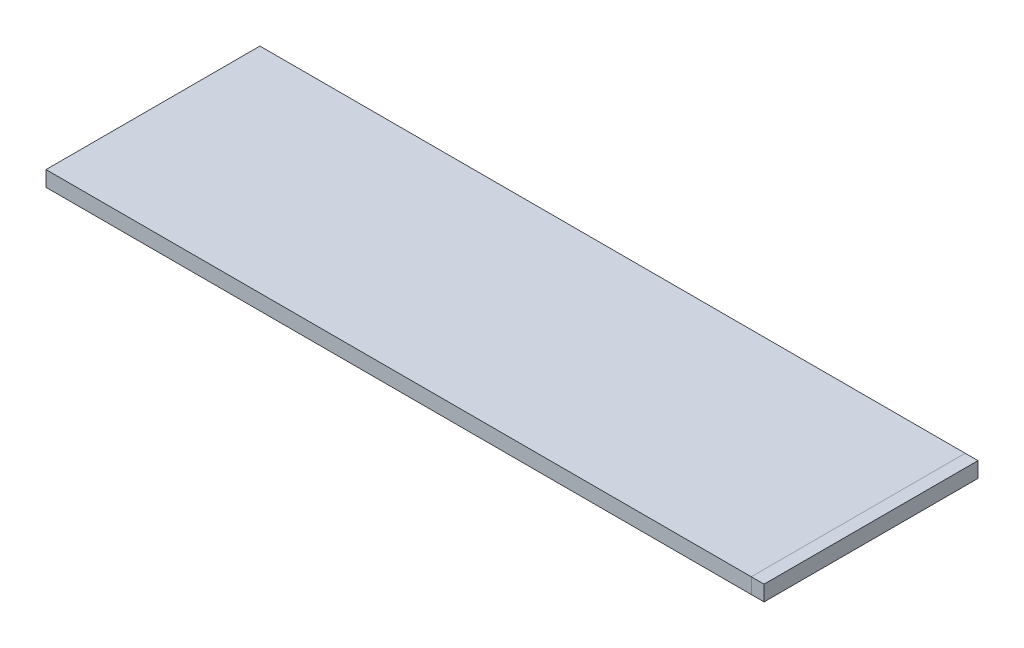
ISO-10303-21;
HEADER;
FILE_DESCRIPTION(('STEP AP214'),'2;1');
FILE_NAME('part.step','',(''),(''),'','','');
FILE_SCHEMA(('AUTOMOTIVE_DESIGN { 1 0 10303 214 1 1 1 1 }'));
ENDSEC;
DATA;
#1=APPLICATION_CONTEXT('core data for automotive mechanical design processes');
#2=APPLICATION_PROTOCOL_DEFINITION('international standard','automotive_design',2000,#1);
#3=PRODUCT_CONTEXT('',#1,'mechanical');
#4=PRODUCT('Part','Part','',(#3));
#5=PRODUCT_RELATED_PRODUCT_CATEGORY('part','',(#4));
#6=PRODUCT_DEFINITION_FORMATION('','',#4);
#7=PRODUCT_DEFINITION_CONTEXT('part definition',#1,'design');
#8=PRODUCT_DEFINITION('design','',#6,#7);
#9=PRODUCT_DEFINITION_SHAPE('','',#8);
#10=(LENGTH_UNIT() NAMED_UNIT(*) SI_UNIT(.MILLI.,.METRE.));
#11=(NAMED_UNIT(*) PLANE_ANGLE_UNIT() SI_UNIT($,.RADIAN.));
#12=(NAMED_UNIT(*) SI_UNIT($,.STERADIAN.) SOLID_ANGLE_UNIT());
#13=UNCERTAINTY_MEASURE_WITH_UNIT(LENGTH_MEASURE(1.E-05),#10,'distance_accuracy_value','');
#14=(GEOMETRIC_REPRESENTATION_CONTEXT(3) GLOBAL_UNCERTAINTY_ASSIGNED_CONTEXT((#13)) GLOBAL_UNIT_ASSIGNED_CONTEXT((#10,
#11,#12)) REPRESENTATION_CONTEXT('',''));
#15=CARTESIAN_POINT('',(0.,0.,0.));
#16=DIRECTION('',(0.,0.,1.));
#17=DIRECTION('',(1.,0.,0.));
#18=AXIS2_PLACEMENT_3D('',#15,#16,#17);
#19=CARTESIAN_POINT('',(-688.586595900051,2.34974736347021E-10,4.0880635946293E-11));
#20=DIRECTION('',(-1.,3.29102447715873E-13,0.));
#21=DIRECTION('',(0.,0.,-1.));
#22=AXIS2_PLACEMENT_3D('',#19,#20,#21);
#23=PLANE('',#22);
#24=DIRECTION('',(-3.29102447715873E-13,-1.,0.));
#25=VECTOR('',#24,1.);
#26=CARTESIAN_POINT('',(-688.58659589993,80.1510631712111,1642.56024697432));
#27=LINE('',#26,#25);
#28=CARTESIAN_POINT('',(-688.58659589993,80.1510631713515,1642.56024697432));
#29=VERTEX_POINT('',#28);
#30=CARTESIAN_POINT('',(-688.58659589994,49.4824319362965,1642.56024697432));
#31=VERTEX_POINT('',#30);
#32=EDGE_CURVE('E72',#29,#31,#27,.T.);
#33=ORIENTED_EDGE('',*,*,#32,.F.);
#34=DIRECTION('',(0.,0.,1.));
#35=VECTOR('',#34,1.);
#36=CARTESIAN_POINT('',(-688.58659589993,80.1510631713515,1642.5602469743));
#37=LINE('',#36,#35);
#38=CARTESIAN_POINT('',(-688.586595899955,80.1510631713515,1217.11024697432));
#39=VERTEX_POINT('',#38);
#40=EDGE_CURVE('E95',#39,#29,#37,.T.);
#41=ORIENTED_EDGE('',*,*,#40,.F.);
#42=DIRECTION('',(3.29102447715873E-13,1.,0.));
#43=VECTOR('',#42,1.);
#44=CARTESIAN_POINT('',(-688.586595899955,80.1510631712111,1217.11024697432));
#45=LINE('',#44,#43);
#46=CARTESIAN_POINT('',(-688.586595899952,49.4824319362965,1217.11024697432));
#47=VERTEX_POINT('',#46);
#48=EDGE_CURVE('E100',#47,#39,#45,.T.);
#49=ORIENTED_EDGE('',*,*,#48,.F.);
#50=DIRECTION('',(0.,0.,-1.));
#51=VECTOR('',#50,1.);
#52=CARTESIAN_POINT('',(-688.58659589994,49.4824319362965,1642.5602469743));
#53=LINE('',#52,#51);
#54=EDGE_CURVE('E115',#31,#47,#53,.T.);
#55=ORIENTED_EDGE('',*,*,#54,.F.);
#56=EDGE_LOOP('',(#33,#41,#49,#55));
#57=FACE_BOUND('',#56,.T.);
#58=ADVANCED_FACE('F63',(#57),#23,.T.);
#59=CARTESIAN_POINT('',(713.986595899993,0.,1.86316690102693E-13));
#60=DIRECTION('',(1.,0.,0.));
#61=DIRECTION('',(0.,0.,-1.));
#62=AXIS2_PLACEMENT_3D('',#59,#60,#61);
#63=PLANE('',#62);
#64=DIRECTION('',(0.,-1.,0.));
#65=VECTOR('',#64,1.);
#66=CARTESIAN_POINT('',(713.986595899993,80.1510631713515,1642.56024697432));
#67=LINE('',#66,#65);
#68=CARTESIAN_POINT('',(713.986595899993,80.1510631713515,1642.56024697432));
#69=VERTEX_POINT('',#68);
#70=CARTESIAN_POINT('',(713.986595899993,49.4824319362965,1642.56024697432));
#71=VERTEX_POINT('',#70);
#72=EDGE_CURVE('E126',#69,#71,#67,.T.);
#73=ORIENTED_EDGE('',*,*,#72,.T.);
#74=DIRECTION('',(0.,0.,-1.));
#75=VECTOR('',#74,1.);
#76=CARTESIAN_POINT('',(713.986595899993,49.4824319362965,1642.56024697432));
#77=LINE('',#76,#75);
#78=CARTESIAN_POINT('',(713.986595899993,49.4824319362965,1217.11024697432));
#79=VERTEX_POINT('',#78);
#80=EDGE_CURVE('E113',#71,#79,#77,.T.);
#81=ORIENTED_EDGE('',*,*,#80,.T.);
#82=DIRECTION('',(0.,1.,0.));
#83=VECTOR('',#82,1.);
#84=CARTESIAN_POINT('',(713.986595899993,80.1510631713515,1217.11024697432));
#85=LINE('',#84,#83);
#86=CARTESIAN_POINT('',(713.986595899993,80.1510631713515,1217.11024697432));
#87=VERTEX_POINT('',#86);
#88=EDGE_CURVE('E117',#79,#87,#85,.T.);
#89=ORIENTED_EDGE('',*,*,#88,.T.);
#90=DIRECTION('',(0.,0.,1.));
#91=VECTOR('',#90,1.);
#92=CARTESIAN_POINT('',(713.986595899993,80.1510631713515,1642.56024697432));
#93=LINE('',#92,#91);
#94=EDGE_CURVE('E123',#87,#69,#93,.T.);
#95=ORIENTED_EDGE('',*,*,#94,.T.);
#96=EDGE_LOOP('',(#73,#81,#89,#95));
#97=FACE_BOUND('',#96,.T.);
#98=ADVANCED_FACE('F125',(#97),#63,.T.);
#99=CARTESIAN_POINT('',(-1115.14054025146,49.4824319362965,1642.56024697432));
#100=DIRECTION('',(0.,-1.,0.));
#101=DIRECTION('',(0.,0.,-1.));
#102=AXIS2_PLACEMENT_3D('',#99,#100,#101);
#103=PLANE('',#102);
#104=DIRECTION('',(1.,0.,0.));
#105=VECTOR('',#104,1.);
#106=CARTESIAN_POINT('',(-1115.14054025146,49.4824319362965,1642.56024697432));
#107=LINE('',#106,#105);
#108=EDGE_CURVE('E12',#31,#71,#107,.T.);
#109=ORIENTED_EDGE('',*,*,#108,.F.);
#110=ORIENTED_EDGE('',*,*,#54,.T.);
#111=DIRECTION('',(1.,0.,0.));
#112=VECTOR('',#111,1.);
#113=CARTESIAN_POINT('',(-1115.14054025146,49.4824319362965,1217.11024697432));
#114=LINE('',#113,#112);
#115=EDGE_CURVE('E110',#47,#79,#114,.T.);
#116=ORIENTED_EDGE('',*,*,#115,.T.);
#117=ORIENTED_EDGE('',*,*,#80,.F.);
#118=EDGE_LOOP('',(#109,#110,#116,#117));
#119=FACE_BOUND('',#118,.T.);
#120=ADVANCED_FACE('F111',(#119),#103,.T.);
#121=CARTESIAN_POINT('',(-1115.14054025146,80.1510631713515,1217.11024697432));
#122=DIRECTION('',(0.,0.,-1.));
#123=DIRECTION('',(-1.,0.,0.));
#124=AXIS2_PLACEMENT_3D('',#121,#122,#123);
#125=PLANE('',#124);
#126=ORIENTED_EDGE('',*,*,#115,.F.);
#127=ORIENTED_EDGE('',*,*,#48,.T.);
#128=DIRECTION('',(1.,0.,0.));
#129=VECTOR('',#128,1.);
#130=CARTESIAN_POINT('',(-1115.14054025146,80.1510631713515,1217.11024697432));
#131=LINE('',#130,#129);
#132=EDGE_CURVE('E105',#39,#87,#131,.T.);
#133=ORIENTED_EDGE('',*,*,#132,.T.);
#134=ORIENTED_EDGE('',*,*,#88,.F.);
#135=EDGE_LOOP('',(#126,#127,#133,#134));
#136=FACE_BOUND('',#135,.T.);
#137=ADVANCED_FACE('F118',(#136),#125,.T.);
#138=CARTESIAN_POINT('',(-1115.14054025146,80.1510631713515,1642.56024697432));
#139=DIRECTION('',(0.,1.,0.));
#140=DIRECTION('',(0.,0.,1.));
#141=AXIS2_PLACEMENT_3D('',#138,#139,#140);
#142=PLANE('',#141);
#143=ORIENTED_EDGE('',*,*,#132,.F.);
#144=ORIENTED_EDGE('',*,*,#40,.T.);
#145=DIRECTION('',(1.,0.,0.));
#146=VECTOR('',#145,1.);
#147=CARTESIAN_POINT('',(-1115.14054025146,80.1510631713515,1642.56024697432));
#148=LINE('',#147,#146);
#149=EDGE_CURVE('E139',#29,#69,#148,.T.);
#150=ORIENTED_EDGE('',*,*,#149,.T.);
#151=ORIENTED_EDGE('',*,*,#94,.F.);
#152=EDGE_LOOP('',(#143,#144,#150,#151));
#153=FACE_BOUND('',#152,.T.);
#154=ADVANCED_FACE('F147',(#153),#142,.T.);
#155=CARTESIAN_POINT('',(-1115.14054025146,80.1510631713515,1642.56024697432));
#156=DIRECTION('',(0.,0.,1.));
#157=DIRECTION('',(1.,0.,0.));
#158=AXIS2_PLACEMENT_3D('',#155,#156,#157);
#159=PLANE('',#158);
#160=ORIENTED_EDGE('',*,*,#149,.F.);
#161=ORIENTED_EDGE('',*,*,#32,.T.);
#162=ORIENTED_EDGE('',*,*,#108,.T.);
#163=ORIENTED_EDGE('',*,*,#72,.F.);
#164=EDGE_LOOP('',(#160,#161,#162,#163));
#165=FACE_BOUND('',#164,.T.);
#166=ADVANCED_FACE('F149',(#165),#159,.T.);
#167=CLOSED_SHELL('',(#58,#98,#120,#137,#154,#166));
#168=MANIFOLD_SOLID_BREP('B2',#167);
#169=CARTESIAN_POINT('',(1152.96896430737,76.499366852603,1245.99503959024));
#170=DIRECTION('',(0.,0.999947907632314,-0.010206959476593));
#171=DIRECTION('',(-1.,0.,0.));
#172=AXIS2_PLACEMENT_3D('',#169,#170,#171);
#173=PLANE('',#172);
#174=DIRECTION('',(0.,0.010206959476593,0.999947907632314));
#175=VECTOR('',#174,1.);
#176=CARTESIAN_POINT('',(713.986595899993,76.499366852603,1245.99503959024));
#177=LINE('',#176,#175);
#178=CARTESIAN_POINT('',(713.986595899993,76.4637958626109,1242.51024697432));
#179=VERTEX_POINT('',#178);
#180=CARTESIAN_POINT('',(713.986595899993,76.499366852603,1245.99503959024));
#181=VERTEX_POINT('',#180);
#182=EDGE_CURVE('E219',#179,#181,#177,.T.);
#183=ORIENTED_EDGE('',*,*,#182,.F.);
#184=DIRECTION('',(-1.,0.,0.));
#185=VECTOR('',#184,1.);
#186=CARTESIAN_POINT('',(1152.96896430737,76.4637958626109,1242.51024697432));
#187=LINE('',#186,#185);
#188=CARTESIAN_POINT('',(-663.186595899993,76.4637958626109,1242.51024697432));
#189=VERTEX_POINT('',#188);
#190=EDGE_CURVE('E470',#179,#189,#187,.T.);
#191=ORIENTED_EDGE('',*,*,#190,.T.);
#192=DIRECTION('',(0.,-0.010206959476593,-0.999947907632314));
#193=VECTOR('',#192,1.);
#194=CARTESIAN_POINT('',(-663.186595899993,76.499366852603,1245.99503959024));
#195=LINE('',#194,#193);
#196=CARTESIAN_POINT('',(-663.186595899993,76.499366852603,1245.99503959024));
#197=VERTEX_POINT('',#196);
#198=EDGE_CURVE('E61',#197,#189,#195,.T.);
#199=ORIENTED_EDGE('',*,*,#198,.F.);
#200=DIRECTION('',(-1.,0.,0.));
#201=VECTOR('',#200,1.);
#202=CARTESIAN_POINT('',(244.891184203689,76.499366852603,1245.99503959024));
#203=LINE('',#202,#201);
#204=EDGE_CURVE('E460',#181,#197,#203,.T.);
#205=ORIENTED_EDGE('',*,*,#204,.F.);
#206=EDGE_LOOP('',(#183,#191,#199,#205));
#207=FACE_BOUND('',#206,.T.);
#208=ADVANCED_FACE('F205',(#207),#173,.T.);
#209=CARTESIAN_POINT('',(1152.96896430737,76.4637958626109,1242.51024697432));
#210=DIRECTION('',(0.,-0.985204744285265,-0.171381480439997));
#211=DIRECTION('',(0.,0.171381480439997,-0.985204744285265));
#212=AXIS2_PLACEMENT_3D('',#209,#210,#211);
#213=PLANE('',#212);
#214=DIRECTION('',(0.,0.171381480439997,-0.985204744285265));
#215=VECTOR('',#214,1.);
#216=CARTESIAN_POINT('',(713.986595899993,76.463795862611,1242.51024697432));
#217=LINE('',#216,#215);
#218=CARTESIAN_POINT('',(713.986595899993,75.8593871493663,1245.98475501479));
#219=VERTEX_POINT('',#218);
#220=EDGE_CURVE('E463',#219,#179,#217,.T.);
#221=ORIENTED_EDGE('',*,*,#220,.F.);
#222=DIRECTION('',(-1.,0.,0.));
#223=VECTOR('',#222,1.);
#224=CARTESIAN_POINT('',(244.891184203689,75.8593871493664,1245.98475501479));
#225=LINE('',#224,#223);
#226=CARTESIAN_POINT('',(-663.186595899993,75.8593871493663,1245.98475501479));
#227=VERTEX_POINT('',#226);
#228=EDGE_CURVE('E453',#219,#227,#225,.T.);
#229=ORIENTED_EDGE('',*,*,#228,.T.);
#230=DIRECTION('',(0.,-0.171381480439997,0.985204744285265));
#231=VECTOR('',#230,1.);
#232=CARTESIAN_POINT('',(-663.186595899993,76.4637958626109,1242.51024697432));
#233=LINE('',#232,#231);
#234=EDGE_CURVE('E469',#189,#227,#233,.T.);
#235=ORIENTED_EDGE('',*,*,#234,.F.);
#236=ORIENTED_EDGE('',*,*,#190,.F.);
#237=EDGE_LOOP('',(#221,#229,#235,#236));
#238=FACE_BOUND('',#237,.T.);
#239=ADVANCED_FACE('F503',(#238),#213,.T.);
#240=CARTESIAN_POINT('',(-663.186595900001,76.499366852603,1245.99503959024));
#241=CARTESIAN_POINT('',(713.986595899992,76.499366852603,1245.99503959024));
#242=CARTESIAN_POINT('',(-663.186595900001,76.5646297976943,1252.38867185063));
#243=CARTESIAN_POINT('',(713.986595899992,76.5646297976943,1252.38867185063));
#244=CARTESIAN_POINT('',(-663.186595900001,76.6950012338333,1265.16080493114));
#245=CARTESIAN_POINT('',(713.986595899992,76.6950012338333,1265.16080493114));
#246=CARTESIAN_POINT('',(-663.186595900001,76.9773001181167,1290.66724093826));
#247=CARTESIAN_POINT('',(713.986595899992,76.9773001181167,1290.66724093826));
#248=CARTESIAN_POINT('',(-663.186595900001,77.3543030326871,1322.48847067392));
#249=CARTESIAN_POINT('',(713.986595899992,77.3543030326871,1322.48847067392));
#250=CARTESIAN_POINT('',(-663.186595900001,77.9162680403241,1360.61870813494));
#251=CARTESIAN_POINT('',(713.986595899992,77.9162680403241,1360.61870813494));
#252=CARTESIAN_POINT('',(-663.186595900001,78.5358461752536,1398.68216567312));
#253=CARTESIAN_POINT('',(713.986595899992,78.5358461752536,1398.68216567312));
#254=CARTESIAN_POINT('',(-663.186595900001,79.186952977143,1436.69102855129));
#255=CARTESIAN_POINT('',(713.986595899992,79.186952977143,1436.69102855129));
#256=CARTESIAN_POINT('',(-663.186595900001,79.6376731894527,1474.59001081164));
#257=CARTESIAN_POINT('',(713.986595899992,79.6376731894527,1474.59001081164));
#258=CARTESIAN_POINT('',(-663.186595900001,79.9503733259163,1506.11097405901));
#259=CARTESIAN_POINT('',(713.986595899992,79.9503733259163,1506.11097405901));
#260=CARTESIAN_POINT('',(-663.186595900001,80.1474877753599,1531.27395373534));
#261=CARTESIAN_POINT('',(713.986595899992,80.1474877753599,1531.27395373534));
#262=CARTESIAN_POINT('',(-663.186595900001,80.1687952888613,1550.17049202947));
#263=CARTESIAN_POINT('',(713.986595899992,80.1687952888613,1550.17049202947));
#264=CARTESIAN_POINT('',(-663.186595900001,79.9653578846433,1569.11801733074));
#265=CARTESIAN_POINT('',(713.986595899992,79.9653578846433,1569.11801733074));
#266=CARTESIAN_POINT('',(-663.186595900001,79.4442090750329,1584.93676699276));
#267=CARTESIAN_POINT('',(713.986595899992,79.4442090750329,1584.93676699276));
#268=CARTESIAN_POINT('',(-663.186595900001,78.6179316835073,1597.66934269598));
#269=CARTESIAN_POINT('',(713.986595899992,78.6179316835073,1597.66934269598));
#270=CARTESIAN_POINT('',(-663.186595900001,77.7011894539018,1607.23157060672));
#271=CARTESIAN_POINT('',(713.986595899992,77.7011894539018,1607.23157060672));
#272=CARTESIAN_POINT('',(-663.186595900001,76.2751604416913,1615.51714652838));
#273=CARTESIAN_POINT('',(713.986595899992,76.2751604416913,1615.51714652838));
#274=CARTESIAN_POINT('',(-663.186595900001,74.6988850107673,1622.07587437183));
#275=CARTESIAN_POINT('',(713.986595899992,74.6988850107673,1622.07587437183));
#276=CARTESIAN_POINT('',(-663.186595900001,70.2817161285073,1629.46107040252));
#277=CARTESIAN_POINT('',(713.986595899992,70.2817161285073,1629.46107040252));
#278=CARTESIAN_POINT('',(-663.186595900001,64.6243116258409,1622.92378847171));
#279=CARTESIAN_POINT('',(713.986595899992,64.6243116258409,1622.92378847171));
#280=CARTESIAN_POINT('',(-663.186595900001,62.2952888024282,1616.53169800888));
#281=CARTESIAN_POINT('',(713.986595899992,62.2952888024282,1616.53169800888));
#282=CARTESIAN_POINT('',(-663.186595900001,59.3682989381772,1608.56933025701));
#283=CARTESIAN_POINT('',(713.986595899992,59.3682989381772,1608.56933025701));
#284=CARTESIAN_POINT('',(-663.186595900001,57.2349710207016,1599.04848422378));
#285=CARTESIAN_POINT('',(713.986595899992,57.2349710207016,1599.04848422378));
#286=CARTESIAN_POINT('',(-663.186595900001,54.8105772036973,1586.33057963594));
#287=CARTESIAN_POINT('',(713.986595899992,54.8105772036973,1586.33057963594));
#288=CARTESIAN_POINT('',(-663.186595900001,52.6221608653713,1570.37428683129));
#289=CARTESIAN_POINT('',(713.986595899992,52.6221608653713,1570.37428683129));
#290=CARTESIAN_POINT('',(-663.186595900001,50.8886050445277,1551.15776822178));
#291=CARTESIAN_POINT('',(713.986595899992,50.8886050445277,1551.15776822178));
#292=CARTESIAN_POINT('',(-663.186595900001,49.8534429772613,1531.91988698097));
#293=CARTESIAN_POINT('',(713.986595899992,49.8534429772613,1531.91988698097));
#294=CARTESIAN_POINT('',(-663.186595900001,49.2720092003839,1506.25992949716));
#295=CARTESIAN_POINT('',(713.986595899992,49.2720092003839,1506.25992949716));
#296=CARTESIAN_POINT('',(-663.186595900001,49.901062710311,1474.25073081649));
#297=CARTESIAN_POINT('',(713.986595899992,49.901062710311,1474.25073081649));
#298=CARTESIAN_POINT('',(-663.186595900001,52.1252103667811,1435.96162601531));
#299=CARTESIAN_POINT('',(713.986595899992,52.1252103667811,1435.96162601531));
#300=CARTESIAN_POINT('',(-663.186595900001,55.2285170927596,1397.79692005989));
#301=CARTESIAN_POINT('',(713.986595899992,55.2285170927596,1397.79692005989));
#302=CARTESIAN_POINT('',(-663.186595900001,59.2036514350586,1359.70204334597));
#303=CARTESIAN_POINT('',(713.986595899992,59.2036514350586,1359.70204334597));
#304=CARTESIAN_POINT('',(-663.186595900001,63.948490811501,1321.68590660716));
#305=CARTESIAN_POINT('',(713.986595899992,63.948490811501,1321.68590660716));
#306=CARTESIAN_POINT('',(-663.186595900001,68.52600932581,1290.08074603011));
#307=CARTESIAN_POINT('',(713.986595899992,68.52600932581,1290.08074603011));
#308=CARTESIAN_POINT('',(-663.186595900001,72.5764008445253,1264.85735241942));
#309=CARTESIAN_POINT('',(713.986595899992,72.5764008445253,1264.85735241942));
#310=CARTESIAN_POINT('',(-663.186595900001,74.7653708136938,1252.27382476412));
#311=CARTESIAN_POINT('',(713.986595899992,74.7653708136938,1252.27382476412));
#312=CARTESIAN_POINT('',(-663.186595900001,75.8593871493664,1245.98475501479));
#313=CARTESIAN_POINT('',(713.986595899992,75.8593871493664,1245.98475501479));
#314=(BOUNDED_SURFACE() B_SPLINE_SURFACE(3,1,((#240,#241),(#242,#243),(#244,#245),(#246,#247),
(#248,#249),(#250,#251),(#252,#253),(#254,#255),(#256,#257),(#258,#259),(#260,#261),(#262,#263),
(#264,#265),(#266,#267),(#268,#269),(#270,#271),(#272,#273),(#274,#275),(#276,#277),(#278,#279),
(#280,#281),(#282,#283),(#284,#285),(#286,#287),(#288,#289),(#290,#291),(#292,#293),(#294,#295),
(#296,#297),(#298,#299),(#300,#301),(#302,#303),(#304,#305),(#306,#307),(#308,#309),(#310,#311),
(#312,#313)),.UNSPECIFIED.,.F.,.F.,.F.) B_SPLINE_SURFACE_WITH_KNOTS((4,1,1,1,1,1,1,1,1,1,1,1,1,
1,1,1,1,1,1,1,1,1,1,1,1,1,1,1,1,1,1,1,1,1,4),(2,2),(0.,0.0249209239259213,0.0497828689401777,
0.0994192024326186,0.148954982369348,0.198414091739069,0.247793886360809,0.297118649713162,
0.346137821653749,0.370655611138527,0.395194930786492,0.419790533628959,0.444494979281921,
0.45690984569632,0.46943565788578,0.482176169238933,0.488808800115614,0.497619319593217,
0.506441571795821,0.513044984189842,0.525971460926511,0.538646761073753,0.551257798956951,
0.57636181679841,0.601409300505454,0.626433493812753,0.651439180859235,0.701431936479585,
0.751161391299154,0.800907818962227,0.850660107810834,0.900433078027226,0.950218746438944,
0.975120031168477,1.),(0.,1.),
.UNSPECIFIED.) GEOMETRIC_REPRESENTATION_ITEM() RATIONAL_B_SPLINE_SURFACE(((1.,1.),(1.,1.),(1.,
1.),(1.,1.),(1.,1.),(1.,1.),(1.,1.),(1.,1.),(1.,1.),(1.,1.),(1.,1.),(1.,1.),(1.,1.),(1.,1.),(1.,
1.),(1.,1.),(1.,1.),(1.,1.),(1.,1.),(1.,1.),(1.,1.),(1.,1.),(1.,1.),(1.,1.),(1.,1.),(1.,1.),(1.,
1.),(1.,1.),(1.,1.),(1.,1.),(1.,1.),(1.,1.),(1.,1.),(1.,1.),(1.,1.),(1.,1.),(1.,1.))) REPRESENTATION_ITEM('') SURFACE());
#315=CARTESIAN_POINT('',(713.986595899993,75.8593871493663,1245.98475501479));
#316=CARTESIAN_POINT('',(713.986595899993,74.7653708136938,1252.27382476412));
#317=CARTESIAN_POINT('',(713.986595899993,72.5764008445253,1264.85735241942));
#318=CARTESIAN_POINT('',(713.986595899993,68.52600932581,1290.08074603011));
#319=CARTESIAN_POINT('',(713.986595899993,63.948490811501,1321.68590660716));
#320=CARTESIAN_POINT('',(713.986595899993,59.2036514350586,1359.70204334597));
#321=CARTESIAN_POINT('',(713.986595899993,55.2285170927596,1397.79692005989));
#322=CARTESIAN_POINT('',(713.986595899993,52.1252103667811,1435.96162601531));
#323=CARTESIAN_POINT('',(713.986595899993,49.901062710311,1474.25073081649));
#324=CARTESIAN_POINT('',(713.986595899993,49.2720092003839,1506.25992949716));
#325=CARTESIAN_POINT('',(713.986595899993,49.8534429772613,1531.91988698097));
#326=CARTESIAN_POINT('',(713.986595899993,50.8886050445277,1551.15776822178));
#327=CARTESIAN_POINT('',(713.986595899993,52.6221608653713,1570.37428683129));
#328=CARTESIAN_POINT('',(713.986595899993,54.8105772036973,1586.33057963594));
#329=CARTESIAN_POINT('',(713.986595899993,57.2349710207016,1599.04848422378));
#330=CARTESIAN_POINT('',(713.986595899993,59.3682989381772,1608.56933025701));
#331=CARTESIAN_POINT('',(713.986595899993,62.2952888024282,1616.53169800888));
#332=CARTESIAN_POINT('',(713.986595899993,64.6243116258409,1622.92378847171));
#333=CARTESIAN_POINT('',(713.986595899993,70.2817161285073,1629.46107040252));
#334=CARTESIAN_POINT('',(713.986595899993,74.6988850107673,1622.07587437183));
#335=CARTESIAN_POINT('',(713.986595899993,76.2751604416913,1615.51714652838));
#336=CARTESIAN_POINT('',(713.986595899993,77.7011894539018,1607.23157060672));
#337=CARTESIAN_POINT('',(713.986595899993,78.6179316835073,1597.66934269598));
#338=CARTESIAN_POINT('',(713.986595899993,79.4442090750329,1584.93676699276));
#339=CARTESIAN_POINT('',(713.986595899993,79.9653578846433,1569.11801733074));
#340=CARTESIAN_POINT('',(713.986595899993,80.1687952888613,1550.17049202947));
#341=CARTESIAN_POINT('',(713.986595899993,80.1474877753599,1531.27395373534));
#342=CARTESIAN_POINT('',(713.986595899993,79.9503733259163,1506.11097405901));
#343=CARTESIAN_POINT('',(713.986595899993,79.6376731894527,1474.59001081164));
#344=CARTESIAN_POINT('',(713.986595899993,79.186952977143,1436.69102855129));
#345=CARTESIAN_POINT('',(713.986595899993,78.5358461752536,1398.68216567312));
#346=CARTESIAN_POINT('',(713.986595899993,77.9162680403241,1360.61870813494));
#347=CARTESIAN_POINT('',(713.986595899993,77.3543030326871,1322.48847067392));
#348=CARTESIAN_POINT('',(713.986595899993,76.9773001181167,1290.66724093826));
#349=CARTESIAN_POINT('',(713.986595899993,76.6950012338333,1265.16080493114));
#350=CARTESIAN_POINT('',(713.986595899993,76.5646297976943,1252.38867185063));
#351=CARTESIAN_POINT('',(713.986595899993,76.499366852603,1245.99503959024));
#352=(BOUNDED_CURVE() B_SPLINE_CURVE(3,(#315,#316,#317,#318,#319,#320,#321,#322,#323,#324,#325,
#326,#327,#328,#329,#330,#331,#332,#333,#334,#335,#336,#337,#338,#339,#340,#341,#342,#343,#344,
#345,#346,#347,#348,#349,#350,#351),.UNSPECIFIED.,.F.,.F.) B_SPLINE_CURVE_WITH_KNOTS((4,1,1,1,1,
1,1,1,1,1,1,1,1,1,1,1,1,1,1,1,1,1,1,1,1,1,1,1,1,1,1,1,1,1,4),(0.,0.0248799688315228,
0.0497812535610554,0.0995669219727736,0.149339892189166,0.199092181037773,0.248838608700846,
0.298568063520415,0.348560819140766,0.373566506187247,0.398590699494547,0.42363818320159,
0.448742201043049,0.461353238926247,0.47402853907349,0.486955015810158,0.493558428204179,
0.502380680406783,0.511191199884386,0.517823830761067,0.53056434211422,0.54309015430368,
0.555505020718079,0.580209466371041,0.604805069213507,0.629344388861473,0.653862178346251,
0.702881350286838,0.752206113639191,0.80158590826093,0.851045017630652,0.900580797567381,
0.950217131059822,0.975079076074079,1.),
.UNSPECIFIED.) CURVE() GEOMETRIC_REPRESENTATION_ITEM() RATIONAL_B_SPLINE_CURVE((1.,1.,1.,1.,1.,
1.,1.,1.,1.,1.,1.,1.,1.,1.,1.,1.,1.,1.,1.,1.,1.,1.,1.,1.,1.,1.,1.,1.,1.,1.,1.,1.,1.,1.,1.,1.,1.)) REPRESENTATION_ITEM(''));
#353=CARTESIAN_POINT('',(713.986595899993,49.4824319362965,1506.68993617421));
#354=VERTEX_POINT('',#353);
#355=EDGE_CURVE('E454',#219,#354,#352,.T.);
#356=CARTESIAN_POINT('',(713.986595899993,80.1510631713515,1541.68473007502));
#357=VERTEX_POINT('',#356);
#358=EDGE_CURVE('E461',#354,#357,#352,.T.);
#359=EDGE_CURVE('E462',#357,#181,#352,.T.);
#360=CARTESIAN_POINT('',(-663.186595899881,76.499366852603,1245.99503959024));
#361=CARTESIAN_POINT('',(-663.186595899881,76.5646297976943,1252.38867185063));
#362=CARTESIAN_POINT('',(-663.186595899881,76.6950012338333,1265.16080493114));
#363=CARTESIAN_POINT('',(-663.186595899881,76.9773001181167,1290.66724093826));
#364=CARTESIAN_POINT('',(-663.186595899881,77.3543030326871,1322.48847067392));
#365=CARTESIAN_POINT('',(-663.186595899881,77.9162680403241,1360.61870813494));
#366=CARTESIAN_POINT('',(-663.186595899881,78.5358461752536,1398.68216567312));
#367=CARTESIAN_POINT('',(-663.186595899881,79.186952977143,1436.69102855129));
#368=CARTESIAN_POINT('',(-663.186595899881,79.6376731894527,1474.59001081164));
#369=CARTESIAN_POINT('',(-663.186595899881,79.9503733259163,1506.11097405901));
#370=CARTESIAN_POINT('',(-663.186595899881,80.1474877753599,1531.27395373534));
#371=CARTESIAN_POINT('',(-663.186595899881,80.1687952888613,1550.17049202947));
#372=CARTESIAN_POINT('',(-663.186595899881,79.9653578846433,1569.11801733074));
#373=CARTESIAN_POINT('',(-663.186595899881,79.4442090750329,1584.93676699276));
#374=CARTESIAN_POINT('',(-663.186595899881,78.6179316835073,1597.66934269598));
#375=CARTESIAN_POINT('',(-663.186595899881,77.7011894539018,1607.23157060672));
#376=CARTESIAN_POINT('',(-663.186595899881,76.2751604416913,1615.51714652838));
#377=CARTESIAN_POINT('',(-663.186595899881,74.6988850107673,1622.07587437183));
#378=CARTESIAN_POINT('',(-663.186595899881,70.2817161285073,1629.46107040252));
#379=CARTESIAN_POINT('',(-663.186595899881,64.6243116258409,1622.92378847171));
#380=CARTESIAN_POINT('',(-663.186595899881,62.2952888024282,1616.53169800888));
#381=CARTESIAN_POINT('',(-663.186595899881,59.3682989381772,1608.56933025701));
#382=CARTESIAN_POINT('',(-663.186595899881,57.2349710207016,1599.04848422378));
#383=CARTESIAN_POINT('',(-663.186595899881,54.8105772036973,1586.33057963594));
#384=CARTESIAN_POINT('',(-663.186595899881,52.6221608653713,1570.37428683129));
#385=CARTESIAN_POINT('',(-663.186595899881,50.8886050445277,1551.15776822177));
#386=CARTESIAN_POINT('',(-663.186595899881,49.8534429772613,1531.91988698097));
#387=CARTESIAN_POINT('',(-663.186595899881,49.2720092003839,1506.25992949716));
#388=CARTESIAN_POINT('',(-663.186595899881,49.901062710311,1474.25073081649));
#389=CARTESIAN_POINT('',(-663.186595899881,52.1252103667811,1435.96162601531));
#390=CARTESIAN_POINT('',(-663.186595899881,55.2285170927596,1397.79692005989));
#391=CARTESIAN_POINT('',(-663.186595899881,59.2036514350586,1359.70204334597));
#392=CARTESIAN_POINT('',(-663.186595899881,63.948490811501,1321.68590660716));
#393=CARTESIAN_POINT('',(-663.186595899881,68.52600932581,1290.08074603011));
#394=CARTESIAN_POINT('',(-663.186595899881,72.5764008445253,1264.85735241942));
#395=CARTESIAN_POINT('',(-663.186595899881,74.7653708136938,1252.27382476412));
#396=CARTESIAN_POINT('',(-663.186595899881,75.8593871493664,1245.98475501479));
#397=(BOUNDED_CURVE() B_SPLINE_CURVE(3,(#360,#361,#362,#363,#364,#365,#366,#367,#368,#369,#370,
#371,#372,#373,#374,#375,#376,#377,#378,#379,#380,#381,#382,#383,#384,#385,#386,#387,#388,#389,
#390,#391,#392,#393,#394,#395,#396),.UNSPECIFIED.,.F.,.F.) B_SPLINE_CURVE_WITH_KNOTS((4,1,1,1,1,
1,1,1,1,1,1,1,1,1,1,1,1,1,1,1,1,1,1,1,1,1,1,1,1,1,1,1,1,1,4),(0.,0.0249209239259213,
0.0497828689401777,0.0994192024326186,0.148954982369348,0.198414091739069,0.247793886360809,
0.297118649713162,0.346137821653749,0.370655611138527,0.395194930786492,0.419790533628959,
0.444494979281921,0.45690984569632,0.46943565788578,0.482176169238933,0.488808800115614,
0.497619319593217,0.506441571795821,0.513044984189842,0.525971460926511,0.538646761073753,
0.551257798956951,0.57636181679841,0.601409300505454,0.626433493812753,0.651439180859235,
0.701431936479585,0.751161391299154,0.800907818962227,0.850660107810834,0.900433078027226,
0.950218746438944,0.975120031168477,1.),
.UNSPECIFIED.) CURVE() GEOMETRIC_REPRESENTATION_ITEM() RATIONAL_B_SPLINE_CURVE((1.,1.,1.,1.,1.,
1.,1.,1.,1.,1.,1.,1.,1.,1.,1.,1.,1.,1.,1.,1.,1.,1.,1.,1.,1.,1.,1.,1.,1.,1.,1.,1.,1.,1.,1.,1.,1.)) REPRESENTATION_ITEM(''));
#398=CARTESIAN_POINT('',(-663.186595899967,80.15103237408,1541.68041142394));
#399=VERTEX_POINT('',#398);
#400=EDGE_CURVE('E226',#399,#197,#397,.F.);
#401=CARTESIAN_POINT('',(-663.186595899881,76.499366852603,1245.99503959024));
#402=CARTESIAN_POINT('',(-663.186595899881,76.5646297976943,1252.38867185063));
#403=CARTESIAN_POINT('',(-663.186595899881,76.6950012338333,1265.16080493114));
#404=CARTESIAN_POINT('',(-663.186595899881,76.9773001181167,1290.66724093826));
#405=CARTESIAN_POINT('',(-663.186595899881,77.3543030326871,1322.48847067392));
#406=CARTESIAN_POINT('',(-663.186595899881,77.9162680403241,1360.61870813494));
#407=CARTESIAN_POINT('',(-663.186595899881,78.5358461752536,1398.68216567312));
#408=CARTESIAN_POINT('',(-663.186595899881,79.186952977143,1436.69102855129));
#409=CARTESIAN_POINT('',(-663.186595899881,79.6376731894527,1474.59001081164));
#410=CARTESIAN_POINT('',(-663.186595899881,79.9503733259163,1506.11097405901));
#411=CARTESIAN_POINT('',(-663.186595899881,80.1474877753599,1531.27395373534));
#412=CARTESIAN_POINT('',(-663.186595899881,80.1687952888613,1550.17049202947));
#413=CARTESIAN_POINT('',(-663.186595899881,79.9653578846433,1569.11801733074));
#414=CARTESIAN_POINT('',(-663.186595899881,79.4442090750329,1584.93676699276));
#415=CARTESIAN_POINT('',(-663.186595899881,78.6179316835073,1597.66934269598));
#416=CARTESIAN_POINT('',(-663.186595899881,77.7011894539018,1607.23157060672));
#417=CARTESIAN_POINT('',(-663.186595899881,76.2751604416913,1615.51714652838));
#418=CARTESIAN_POINT('',(-663.186595899881,74.6988850107673,1622.07587437183));
#419=CARTESIAN_POINT('',(-663.186595899881,70.2817161285073,1629.46107040252));
#420=CARTESIAN_POINT('',(-663.186595899881,64.6243116258409,1622.92378847171));
#421=CARTESIAN_POINT('',(-663.186595899881,62.2952888024282,1616.53169800888));
#422=CARTESIAN_POINT('',(-663.186595899881,59.3682989381772,1608.56933025701));
#423=CARTESIAN_POINT('',(-663.186595899881,57.2349710207016,1599.04848422378));
#424=CARTESIAN_POINT('',(-663.186595899881,54.8105772036973,1586.33057963594));
#425=CARTESIAN_POINT('',(-663.186595899881,52.6221608653713,1570.37428683129));
#426=CARTESIAN_POINT('',(-663.186595899881,50.8886050445277,1551.15776822177));
#427=CARTESIAN_POINT('',(-663.186595899881,49.8534429772613,1531.91988698097));
#428=CARTESIAN_POINT('',(-663.186595899881,49.2720092003839,1506.25992949716));
#429=CARTESIAN_POINT('',(-663.186595899881,49.901062710311,1474.25073081649));
#430=CARTESIAN_POINT('',(-663.186595899881,52.1252103667811,1435.96162601531));
#431=CARTESIAN_POINT('',(-663.186595899881,55.2285170927596,1397.79692005989));
#432=CARTESIAN_POINT('',(-663.186595899881,59.2036514350586,1359.70204334597));
#433=CARTESIAN_POINT('',(-663.186595899881,63.948490811501,1321.68590660716));
#434=CARTESIAN_POINT('',(-663.186595899881,68.52600932581,1290.08074603011));
#435=CARTESIAN_POINT('',(-663.186595899881,72.5764008445253,1264.85735241942));
#436=CARTESIAN_POINT('',(-663.186595899881,74.7653708136938,1252.27382476412));
#437=CARTESIAN_POINT('',(-663.186595899881,75.8593871493664,1245.98475501479));
#438=(BOUNDED_CURVE() B_SPLINE_CURVE(3,(#401,#402,#403,#404,#405,#406,#407,#408,#409,#410,#411,
#412,#413,#414,#415,#416,#417,#418,#419,#420,#421,#422,#423,#424,#425,#426,#427,#428,#429,#430,
#431,#432,#433,#434,#435,#436,#437),.UNSPECIFIED.,.F.,.F.) B_SPLINE_CURVE_WITH_KNOTS((4,1,1,1,1,
1,1,1,1,1,1,1,1,1,1,1,1,1,1,1,1,1,1,1,1,1,1,1,1,1,1,1,1,1,4),(0.,0.0249209239259213,
0.0497828689401777,0.0994192024326186,0.148954982369348,0.198414091739069,0.247793886360809,
0.297118649713162,0.346137821653749,0.370655611138527,0.395194930786492,0.419790533628959,
0.444494979281921,0.45690984569632,0.46943565788578,0.482176169238933,0.488808800115614,
0.497619319593217,0.506441571795821,0.513044984189842,0.525971460926511,0.538646761073753,
0.551257798956951,0.57636181679841,0.601409300505454,0.626433493812753,0.651439180859235,
0.701431936479585,0.751161391299154,0.800907818962227,0.850660107810834,0.900433078027226,
0.950218746438944,0.975120031168477,1.),
.UNSPECIFIED.) CURVE() GEOMETRIC_REPRESENTATION_ITEM() RATIONAL_B_SPLINE_CURVE((1.,1.,1.,1.,1.,
1.,1.,1.,1.,1.,1.,1.,1.,1.,1.,1.,1.,1.,1.,1.,1.,1.,1.,1.,1.,1.,1.,1.,1.,1.,1.,1.,1.,1.,1.,1.,1.)) REPRESENTATION_ITEM(''));
#439=CARTESIAN_POINT('',(-663.186595899976,49.4824386955187,1506.70223551438));
#440=VERTEX_POINT('',#439);
#441=EDGE_CURVE('E230',#440,#399,#438,.F.);
#442=CARTESIAN_POINT('',(-663.186595899881,76.499366852603,1245.99503959024));
#443=CARTESIAN_POINT('',(-663.186595899881,76.5646297976943,1252.38867185063));
#444=CARTESIAN_POINT('',(-663.186595899881,76.6950012338333,1265.16080493114));
#445=CARTESIAN_POINT('',(-663.186595899881,76.9773001181167,1290.66724093826));
#446=CARTESIAN_POINT('',(-663.186595899881,77.3543030326871,1322.48847067392));
#447=CARTESIAN_POINT('',(-663.186595899881,77.9162680403241,1360.61870813494));
#448=CARTESIAN_POINT('',(-663.186595899881,78.5358461752536,1398.68216567312));
#449=CARTESIAN_POINT('',(-663.186595899881,79.186952977143,1436.69102855129));
#450=CARTESIAN_POINT('',(-663.186595899881,79.6376731894527,1474.59001081164));
#451=CARTESIAN_POINT('',(-663.186595899881,79.9503733259163,1506.11097405901));
#452=CARTESIAN_POINT('',(-663.186595899881,80.1474877753599,1531.27395373534));
#453=CARTESIAN_POINT('',(-663.186595899881,80.1687952888613,1550.17049202947));
#454=CARTESIAN_POINT('',(-663.186595899881,79.9653578846433,1569.11801733074));
#455=CARTESIAN_POINT('',(-663.186595899881,79.4442090750329,1584.93676699276));
#456=CARTESIAN_POINT('',(-663.186595899881,78.6179316835073,1597.66934269598));
#457=CARTESIAN_POINT('',(-663.186595899881,77.7011894539018,1607.23157060672));
#458=CARTESIAN_POINT('',(-663.186595899881,76.2751604416913,1615.51714652838));
#459=CARTESIAN_POINT('',(-663.186595899881,74.6988850107673,1622.07587437183));
#460=CARTESIAN_POINT('',(-663.186595899881,70.2817161285073,1629.46107040252));
#461=CARTESIAN_POINT('',(-663.186595899881,64.6243116258409,1622.92378847171));
#462=CARTESIAN_POINT('',(-663.186595899881,62.2952888024282,1616.53169800888));
#463=CARTESIAN_POINT('',(-663.186595899881,59.3682989381772,1608.56933025701));
#464=CARTESIAN_POINT('',(-663.186595899881,57.2349710207016,1599.04848422378));
#465=CARTESIAN_POINT('',(-663.186595899881,54.8105772036973,1586.33057963594));
#466=CARTESIAN_POINT('',(-663.186595899881,52.6221608653713,1570.37428683129));
#467=CARTESIAN_POINT('',(-663.186595899881,50.8886050445277,1551.15776822177));
#468=CARTESIAN_POINT('',(-663.186595899881,49.8534429772613,1531.91988698097));
#469=CARTESIAN_POINT('',(-663.186595899881,49.2720092003839,1506.25992949716));
#470=CARTESIAN_POINT('',(-663.186595899881,49.901062710311,1474.25073081649));
#471=CARTESIAN_POINT('',(-663.186595899881,52.1252103667811,1435.96162601531));
#472=CARTESIAN_POINT('',(-663.186595899881,55.2285170927596,1397.79692005989));
#473=CARTESIAN_POINT('',(-663.186595899881,59.2036514350586,1359.70204334597));
#474=CARTESIAN_POINT('',(-663.186595899881,63.948490811501,1321.68590660716));
#475=CARTESIAN_POINT('',(-663.186595899881,68.52600932581,1290.08074603011));
#476=CARTESIAN_POINT('',(-663.186595899881,72.5764008445253,1264.85735241942));
#477=CARTESIAN_POINT('',(-663.186595899881,74.7653708136938,1252.27382476412));
#478=CARTESIAN_POINT('',(-663.186595899881,75.8593871493664,1245.98475501479));
#479=(BOUNDED_CURVE() B_SPLINE_CURVE(3,(#442,#443,#444,#445,#446,#447,#448,#449,#450,#451,#452,
#453,#454,#455,#456,#457,#458,#459,#460,#461,#462,#463,#464,#465,#466,#467,#468,#469,#470,#471,
#472,#473,#474,#475,#476,#477,#478),.UNSPECIFIED.,.F.,.F.) B_SPLINE_CURVE_WITH_KNOTS((4,1,1,1,1,
1,1,1,1,1,1,1,1,1,1,1,1,1,1,1,1,1,1,1,1,1,1,1,1,1,1,1,1,1,4),(0.,0.0249209239259213,
0.0497828689401777,0.0994192024326186,0.148954982369348,0.198414091739069,0.247793886360809,
0.297118649713162,0.346137821653749,0.370655611138527,0.395194930786492,0.419790533628959,
0.444494979281921,0.45690984569632,0.46943565788578,0.482176169238933,0.488808800115614,
0.497619319593217,0.506441571795821,0.513044984189842,0.525971460926511,0.538646761073753,
0.551257798956951,0.57636181679841,0.601409300505454,0.626433493812753,0.651439180859235,
0.701431936479585,0.751161391299154,0.800907818962227,0.850660107810834,0.900433078027226,
0.950218746438944,0.975120031168477,1.),
.UNSPECIFIED.) CURVE() GEOMETRIC_REPRESENTATION_ITEM() RATIONAL_B_SPLINE_CURVE((1.,1.,1.,1.,1.,
1.,1.,1.,1.,1.,1.,1.,1.,1.,1.,1.,1.,1.,1.,1.,1.,1.,1.,1.,1.,1.,1.,1.,1.,1.,1.,1.,1.,1.,1.,1.,1.)) REPRESENTATION_ITEM(''));
#480=EDGE_CURVE('E398',#227,#440,#479,.F.);
#481=ORIENTED_EDGE('',*,*,#228,.F.);
#482=ORIENTED_EDGE('',*,*,#355,.T.);
#483=ORIENTED_EDGE('',*,*,#358,.T.);
#484=ORIENTED_EDGE('',*,*,#359,.T.);
#485=ORIENTED_EDGE('',*,*,#204,.T.);
#486=ORIENTED_EDGE('',*,*,#400,.F.);
#487=ORIENTED_EDGE('',*,*,#441,.F.);
#488=ORIENTED_EDGE('',*,*,#480,.F.);
#489=EDGE_LOOP('',(#481,#482,#483,#484,#485,#486,#487,#488));
#490=FACE_BOUND('',#489,.T.);
#491=ADVANCED_FACE('F207',(#490),#314,.T.);
#492=CARTESIAN_POINT('',(713.986595899993,0.,1.86316690102693E-13));
#493=DIRECTION('',(1.,0.,0.));
#494=DIRECTION('',(0.,0.,-1.));
#495=AXIS2_PLACEMENT_3D('',#492,#493,#494);
#496=PLANE('',#495);
#497=ORIENTED_EDGE('',*,*,#355,.F.);
#498=ORIENTED_EDGE('',*,*,#220,.T.);
#499=ORIENTED_EDGE('',*,*,#182,.T.);
#500=ORIENTED_EDGE('',*,*,#359,.F.);
#501=DIRECTION('',(0.,0.,1.));
#502=VECTOR('',#501,1.);
#503=CARTESIAN_POINT('',(713.986595899993,80.1510631713515,1642.56024697432));
#504=LINE('',#503,#502);
#505=CARTESIAN_POINT('',(713.986595899993,80.1510631713515,1217.11024697432));
#506=VERTEX_POINT('',#505);
#507=EDGE_CURVE('E413',#506,#357,#504,.T.);
#508=ORIENTED_EDGE('',*,*,#507,.F.);
#509=DIRECTION('',(0.,1.,0.));
#510=VECTOR('',#509,1.);
#511=CARTESIAN_POINT('',(713.986595899993,80.1510631713515,1217.11024697432));
#512=LINE('',#511,#510);
#513=CARTESIAN_POINT('',(713.986595899993,49.4824319362965,1217.11024697432));
#514=VERTEX_POINT('',#513);
#515=EDGE_CURVE('E431',#514,#506,#512,.T.);
#516=ORIENTED_EDGE('',*,*,#515,.F.);
#517=DIRECTION('',(0.,0.,-1.));
#518=VECTOR('',#517,1.);
#519=CARTESIAN_POINT('',(713.986595899993,49.4824319362965,1642.56024697432));
#520=LINE('',#519,#518);
#521=EDGE_CURVE('E426',#354,#514,#520,.T.);
#522=ORIENTED_EDGE('',*,*,#521,.F.);
#523=EDGE_LOOP('',(#497,#498,#499,#500,#508,#516,#522));
#524=FACE_BOUND('',#523,.T.);
#525=ADVANCED_FACE('F506',(#524),#496,.F.);
#526=CARTESIAN_POINT('',(739.386595899993,80.1510631713515,1642.56024697432));
#527=DIRECTION('',(0.,0.,-1.));
#528=DIRECTION('',(-1.,0.,0.));
#529=AXIS2_PLACEMENT_3D('',#526,#527,#528);
#530=PLANE('',#529);
#531=DIRECTION('',(0.,-1.,0.));
#532=VECTOR('',#531,1.);
#533=CARTESIAN_POINT('',(713.986595899993,80.1510631713515,1642.56024697432));
#534=LINE('',#533,#532);
#535=CARTESIAN_POINT('',(713.986595899993,80.1510631713515,1642.56024697432));
#536=VERTEX_POINT('',#535);
#537=CARTESIAN_POINT('',(713.986595899993,49.4824319362965,1642.56024697432));
#538=VERTEX_POINT('',#537);
#539=EDGE_CURVE('E324',#536,#538,#534,.T.);
#540=ORIENTED_EDGE('',*,*,#539,.T.);
#541=DIRECTION('',(-1.,0.,0.));
#542=VECTOR('',#541,1.);
#543=CARTESIAN_POINT('',(739.386595899993,49.4824319362965,1642.56024697432));
#544=LINE('',#543,#542);
#545=CARTESIAN_POINT('',(739.386595899993,49.4824319362965,1642.56024697432));
#546=VERTEX_POINT('',#545);
#547=EDGE_CURVE('E449',#546,#538,#544,.T.);
#548=ORIENTED_EDGE('',*,*,#547,.F.);
#549=DIRECTION('',(0.,-1.,0.));
#550=VECTOR('',#549,1.);
#551=CARTESIAN_POINT('',(739.386595899993,80.1510631713515,1642.56024697432));
#552=LINE('',#551,#550);
#553=CARTESIAN_POINT('',(739.386595899993,80.1510631713515,1642.56024697432));
#554=VERTEX_POINT('',#553);
#555=EDGE_CURVE('E403',#554,#546,#552,.T.);
#556=ORIENTED_EDGE('',*,*,#555,.F.);
#557=DIRECTION('',(-1.,0.,0.));
#558=VECTOR('',#557,1.);
#559=CARTESIAN_POINT('',(739.386595899993,80.1510631713515,1642.56024697432));
#560=LINE('',#559,#558);
#561=EDGE_CURVE('E422',#554,#536,#560,.T.);
#562=ORIENTED_EDGE('',*,*,#561,.T.);
#563=EDGE_LOOP('',(#540,#548,#556,#562));
#564=FACE_BOUND('',#563,.T.);
#565=ADVANCED_FACE('F625',(#564),#530,.F.);
#566=CARTESIAN_POINT('',(739.386595899993,49.4824319362965,1642.56024697432));
#567=DIRECTION('',(0.,1.,0.));
#568=DIRECTION('',(0.,0.,1.));
#569=AXIS2_PLACEMENT_3D('',#566,#567,#568);
#570=PLANE('',#569);
#571=EDGE_CURVE('E427',#538,#354,#520,.T.);
#572=ORIENTED_EDGE('',*,*,#571,.T.);
#573=ORIENTED_EDGE('',*,*,#521,.T.);
#574=DIRECTION('',(-1.,0.,0.));
#575=VECTOR('',#574,1.);
#576=CARTESIAN_POINT('',(739.386595899993,49.4824319362965,1217.11024697432));
#577=LINE('',#576,#575);
#578=CARTESIAN_POINT('',(739.386595899993,49.4824319362965,1217.11024697432));
#579=VERTEX_POINT('',#578);
#580=EDGE_CURVE('E445',#579,#514,#577,.T.);
#581=ORIENTED_EDGE('',*,*,#580,.F.);
#582=DIRECTION('',(0.,0.,-1.));
#583=VECTOR('',#582,1.);
#584=CARTESIAN_POINT('',(739.386595899993,49.4824319362965,1642.56024697432));
#585=LINE('',#584,#583);
#586=EDGE_CURVE('E412',#546,#579,#585,.T.);
#587=ORIENTED_EDGE('',*,*,#586,.F.);
#588=ORIENTED_EDGE('',*,*,#547,.T.);
#589=EDGE_LOOP('',(#572,#573,#581,#587,#588));
#590=FACE_BOUND('',#589,.T.);
#591=ADVANCED_FACE('F609',(#590),#570,.F.);
#592=CARTESIAN_POINT('',(739.386595899993,80.1510631713515,1217.11024697432));
#593=DIRECTION('',(0.,0.,1.));
#594=DIRECTION('',(1.,0.,0.));
#595=AXIS2_PLACEMENT_3D('',#592,#593,#594);
#596=PLANE('',#595);
#597=ORIENTED_EDGE('',*,*,#515,.T.);
#598=DIRECTION('',(-1.,0.,0.));
#599=VECTOR('',#598,1.);
#600=CARTESIAN_POINT('',(739.386595899993,80.1510631713515,1217.11024697432));
#601=LINE('',#600,#599);
#602=CARTESIAN_POINT('',(739.386595899993,80.1510631713515,1217.11024697432));
#603=VERTEX_POINT('',#602);
#604=EDGE_CURVE('E441',#603,#506,#601,.T.);
#605=ORIENTED_EDGE('',*,*,#604,.F.);
#606=DIRECTION('',(0.,1.,0.));
#607=VECTOR('',#606,1.);
#608=CARTESIAN_POINT('',(739.386595899993,80.1510631713515,1217.11024697432));
#609=LINE('',#608,#607);
#610=EDGE_CURVE('E416',#579,#603,#609,.T.);
#611=ORIENTED_EDGE('',*,*,#610,.F.);
#612=ORIENTED_EDGE('',*,*,#580,.T.);
#613=EDGE_LOOP('',(#597,#605,#611,#612));
#614=FACE_BOUND('',#613,.T.);
#615=ADVANCED_FACE('F613',(#614),#596,.F.);
#616=CARTESIAN_POINT('',(739.386595899993,80.1510631713515,1642.56024697432));
#617=DIRECTION('',(0.,-1.,0.));
#618=DIRECTION('',(0.,0.,-1.));
#619=AXIS2_PLACEMENT_3D('',#616,#617,#618);
#620=PLANE('',#619);
#621=ORIENTED_EDGE('',*,*,#507,.T.);
#622=EDGE_CURVE('E434',#357,#536,#504,.T.);
#623=ORIENTED_EDGE('',*,*,#622,.T.);
#624=ORIENTED_EDGE('',*,*,#561,.F.);
#625=DIRECTION('',(0.,0.,1.));
#626=VECTOR('',#625,1.);
#627=CARTESIAN_POINT('',(739.386595899993,80.1510631713515,1642.56024697432));
#628=LINE('',#627,#626);
#629=EDGE_CURVE('E419',#603,#554,#628,.T.);
#630=ORIENTED_EDGE('',*,*,#629,.F.);
#631=ORIENTED_EDGE('',*,*,#604,.T.);
#632=EDGE_LOOP('',(#621,#623,#624,#630,#631));
#633=FACE_BOUND('',#632,.T.);
#634=ADVANCED_FACE('F616',(#633),#620,.F.);
#635=CARTESIAN_POINT('',(739.386595899993,0.,1.91867805225819E-13));
#636=DIRECTION('',(1.,0.,0.));
#637=DIRECTION('',(0.,0.,-1.));
#638=AXIS2_PLACEMENT_3D('',#635,#636,#637);
#639=PLANE('',#638);
#640=ORIENTED_EDGE('',*,*,#555,.T.);
#641=ORIENTED_EDGE('',*,*,#586,.T.);
#642=ORIENTED_EDGE('',*,*,#610,.T.);
#643=ORIENTED_EDGE('',*,*,#629,.T.);
#644=EDGE_LOOP('',(#640,#641,#642,#643));
#645=FACE_BOUND('',#644,.T.);
#646=ADVANCED_FACE('F621',(#645),#639,.T.);
#647=ORIENTED_EDGE('',*,*,#358,.F.);
#648=ORIENTED_EDGE('',*,*,#571,.F.);
#649=ORIENTED_EDGE('',*,*,#539,.F.);
#650=ORIENTED_EDGE('',*,*,#622,.F.);
#651=EDGE_LOOP('',(#647,#648,#649,#650));
#652=FACE_BOUND('',#651,.T.);
#653=ADVANCED_FACE('F383',(#652),#496,.F.);
#654=CARTESIAN_POINT('',(-663.186595900051,2.26615534175038E-10,3.9427586073185E-11));
#655=DIRECTION('',(-1.,3.29102447715873E-13,0.));
#656=DIRECTION('',(0.,0.,-1.));
#657=AXIS2_PLACEMENT_3D('',#654,#655,#656);
#658=PLANE('',#657);
#659=ORIENTED_EDGE('',*,*,#234,.T.);
#660=ORIENTED_EDGE('',*,*,#480,.T.);
#661=DIRECTION('',(0.,0.,-1.));
#662=VECTOR('',#661,1.);
#663=CARTESIAN_POINT('',(-663.18659589994,49.4824319365232,1642.56024697436));
#664=LINE('',#663,#662);
#665=CARTESIAN_POINT('',(-663.186595899965,49.4824319365232,1217.11024697436));
#666=VERTEX_POINT('',#665);
#667=EDGE_CURVE('E596',#440,#666,#664,.T.);
#668=ORIENTED_EDGE('',*,*,#667,.T.);
#669=DIRECTION('',(3.29102447715873E-13,1.,0.));
#670=VECTOR('',#669,1.);
#671=CARTESIAN_POINT('',(-663.186595899954,80.1510631715781,1217.11024697436));
#672=LINE('',#671,#670);
#673=CARTESIAN_POINT('',(-663.186595899954,80.1510631715781,1217.11024697436));
#674=VERTEX_POINT('',#673);
#675=EDGE_CURVE('E355',#666,#674,#672,.T.);
#676=ORIENTED_EDGE('',*,*,#675,.T.);
#677=DIRECTION('',(0.,0.,1.));
#678=VECTOR('',#677,1.);
#679=CARTESIAN_POINT('',(-663.18659589993,80.1510631715781,1642.56024697436));
#680=LINE('',#679,#678);
#681=EDGE_CURVE('E361',#674,#399,#680,.T.);
#682=ORIENTED_EDGE('',*,*,#681,.T.);
#683=ORIENTED_EDGE('',*,*,#400,.T.);
#684=ORIENTED_EDGE('',*,*,#198,.T.);
#685=EDGE_LOOP('',(#659,#660,#668,#676,#682,#683,#684));
#686=FACE_BOUND('',#685,.T.);
#687=ADVANCED_FACE('F372',(#686),#658,.F.);
#688=CARTESIAN_POINT('',(-663.18659589994,49.4824319365232,1642.56024697436));
#689=VERTEX_POINT('',#688);
#690=EDGE_CURVE('E336',#689,#440,#664,.T.);
#691=ORIENTED_EDGE('',*,*,#690,.T.);
#692=ORIENTED_EDGE('',*,*,#441,.T.);
#693=CARTESIAN_POINT('',(-663.18659589993,80.1510631715781,1642.56024697436));
#694=VERTEX_POINT('',#693);
#695=EDGE_CURVE('E352',#399,#694,#680,.T.);
#696=ORIENTED_EDGE('',*,*,#695,.T.);
#697=DIRECTION('',(-3.29102447715873E-13,-1.,0.));
#698=VECTOR('',#697,1.);
#699=CARTESIAN_POINT('',(-663.18659589993,80.1510631715781,1642.56024697436));
#700=LINE('',#699,#698);
#701=EDGE_CURVE('E319',#694,#689,#700,.T.);
#702=ORIENTED_EDGE('',*,*,#701,.T.);
#703=EDGE_LOOP('',(#691,#692,#696,#702));
#704=FACE_BOUND('',#703,.T.);
#705=ADVANCED_FACE('F382',(#704),#658,.F.);
#706=CARTESIAN_POINT('',(-688.58659589993,80.1510631715865,1642.56024697436));
#707=DIRECTION('',(0.,0.,1.));
#708=DIRECTION('',(1.,0.,0.));
#709=AXIS2_PLACEMENT_3D('',#706,#707,#708);
#710=PLANE('',#709);
#711=ORIENTED_EDGE('',*,*,#701,.F.);
#712=DIRECTION('',(1.,-3.29102447715873E-13,0.));
#713=VECTOR('',#712,1.);
#714=CARTESIAN_POINT('',(-688.58659589993,80.1510631715865,1642.56024697436));
#715=LINE('',#714,#713);
#716=CARTESIAN_POINT('',(-688.58659589993,80.1510631715865,1642.56024697436));
#717=VERTEX_POINT('',#716);
#718=EDGE_CURVE('E313',#717,#694,#715,.T.);
#719=ORIENTED_EDGE('',*,*,#718,.F.);
#720=DIRECTION('',(-3.29102447715873E-13,-1.,0.));
#721=VECTOR('',#720,1.);
#722=CARTESIAN_POINT('',(-688.58659589993,80.1510631715865,1642.56024697436));
#723=LINE('',#722,#721);
#724=CARTESIAN_POINT('',(-688.58659589994,49.4824319365315,1642.56024697436));
#725=VERTEX_POINT('',#724);
#726=EDGE_CURVE('E316',#717,#725,#723,.T.);
#727=ORIENTED_EDGE('',*,*,#726,.T.);
#728=DIRECTION('',(1.,-3.29102447715873E-13,0.));
#729=VECTOR('',#728,1.);
#730=CARTESIAN_POINT('',(-688.58659589994,49.4824319365315,1642.56024697436));
#731=LINE('',#730,#729);
#732=EDGE_CURVE('E349',#725,#689,#731,.T.);
#733=ORIENTED_EDGE('',*,*,#732,.T.);
#734=EDGE_LOOP('',(#711,#719,#727,#733));
#735=FACE_BOUND('',#734,.T.);
#736=ADVANCED_FACE('F315',(#735),#710,.T.);
#737=CARTESIAN_POINT('',(-688.58659589993,80.1510631715865,1642.56024697436));
#738=DIRECTION('',(3.29102447715873E-13,1.,0.));
#739=DIRECTION('',(-1.,3.29102447715873E-13,0.));
#740=AXIS2_PLACEMENT_3D('',#737,#738,#739);
#741=PLANE('',#740);
#742=ORIENTED_EDGE('',*,*,#681,.F.);
#743=DIRECTION('',(1.,-3.29102447715873E-13,0.));
#744=VECTOR('',#743,1.);
#745=CARTESIAN_POINT('',(-688.586595899954,80.1510631715865,1217.11024697436));
#746=LINE('',#745,#744);
#747=CARTESIAN_POINT('',(-688.586595899954,80.1510631715865,1217.11024697436));
#748=VERTEX_POINT('',#747);
#749=EDGE_CURVE('E325',#748,#674,#746,.T.);
#750=ORIENTED_EDGE('',*,*,#749,.F.);
#751=DIRECTION('',(0.,0.,1.));
#752=VECTOR('',#751,1.);
#753=CARTESIAN_POINT('',(-688.58659589993,80.1510631715865,1642.56024697436));
#754=LINE('',#753,#752);
#755=EDGE_CURVE('E331',#748,#717,#754,.T.);
#756=ORIENTED_EDGE('',*,*,#755,.T.);
#757=ORIENTED_EDGE('',*,*,#718,.T.);
#758=ORIENTED_EDGE('',*,*,#695,.F.);
#759=EDGE_LOOP('',(#742,#750,#756,#757,#758));
#760=FACE_BOUND('',#759,.T.);
#761=ADVANCED_FACE('F339',(#760),#741,.T.);
#762=CARTESIAN_POINT('',(-688.586595899954,80.1510631715865,1217.11024697436));
#763=DIRECTION('',(0.,0.,-1.));
#764=DIRECTION('',(-1.,0.,0.));
#765=AXIS2_PLACEMENT_3D('',#762,#763,#764);
#766=PLANE('',#765);
#767=ORIENTED_EDGE('',*,*,#675,.F.);
#768=DIRECTION('',(1.,-3.29102447715873E-13,0.));
#769=VECTOR('',#768,1.);
#770=CARTESIAN_POINT('',(-688.586595899965,49.4824319365315,1217.11024697436));
#771=LINE('',#770,#769);
#772=CARTESIAN_POINT('',(-688.586595899965,49.4824319365315,1217.11024697436));
#773=VERTEX_POINT('',#772);
#774=EDGE_CURVE('E588',#773,#666,#771,.T.);
#775=ORIENTED_EDGE('',*,*,#774,.F.);
#776=DIRECTION('',(3.29102447715873E-13,1.,0.));
#777=VECTOR('',#776,1.);
#778=CARTESIAN_POINT('',(-688.586595899954,80.1510631715865,1217.11024697436));
#779=LINE('',#778,#777);
#780=EDGE_CURVE('E341',#773,#748,#779,.T.);
#781=ORIENTED_EDGE('',*,*,#780,.T.);
#782=ORIENTED_EDGE('',*,*,#749,.T.);
#783=EDGE_LOOP('',(#767,#775,#781,#782));
#784=FACE_BOUND('',#783,.T.);
#785=ADVANCED_FACE('F637',(#784),#766,.T.);
#786=CARTESIAN_POINT('',(-688.58659589994,49.4824319365315,1642.56024697436));
#787=DIRECTION('',(-3.29102447715873E-13,-1.,0.));
#788=DIRECTION('',(1.,-3.29102447715873E-13,0.));
#789=AXIS2_PLACEMENT_3D('',#786,#787,#788);
#790=PLANE('',#789);
#791=ORIENTED_EDGE('',*,*,#690,.F.);
#792=ORIENTED_EDGE('',*,*,#732,.F.);
#793=DIRECTION('',(0.,0.,-1.));
#794=VECTOR('',#793,1.);
#795=CARTESIAN_POINT('',(-688.58659589994,49.4824319365315,1642.56024697436));
#796=LINE('',#795,#794);
#797=EDGE_CURVE('E334',#725,#773,#796,.T.);
#798=ORIENTED_EDGE('',*,*,#797,.T.);
#799=ORIENTED_EDGE('',*,*,#774,.T.);
#800=ORIENTED_EDGE('',*,*,#667,.F.);
#801=EDGE_LOOP('',(#791,#792,#798,#799,#800));
#802=FACE_BOUND('',#801,.T.);
#803=ADVANCED_FACE('F384',(#802),#790,.T.);
#804=CARTESIAN_POINT('',(-688.586595900051,2.34974736347021E-10,4.0880635946293E-11));
#805=DIRECTION('',(-1.,3.29102447715873E-13,0.));
#806=DIRECTION('',(0.,0.,-1.));
#807=AXIS2_PLACEMENT_3D('',#804,#805,#806);
#808=PLANE('',#807);
#809=ORIENTED_EDGE('',*,*,#726,.F.);
#810=ORIENTED_EDGE('',*,*,#755,.F.);
#811=ORIENTED_EDGE('',*,*,#780,.F.);
#812=ORIENTED_EDGE('',*,*,#797,.F.);
#813=EDGE_LOOP('',(#809,#810,#811,#812));
#814=FACE_BOUND('',#813,.T.);
#815=ADVANCED_FACE('F329',(#814),#808,.T.);
#816=CLOSED_SHELL('',(#208,#239,#491,#525,#565,#591,#615,#634,#646,#653,#687,#705,#736,#761,
#785,#803,#815));
#817=MANIFOLD_SOLID_BREP('B6',#816);
#818=ADVANCED_BREP_SHAPE_REPRESENTATION('',(#18,#168,#817),#14);
#819=SHAPE_DEFINITION_REPRESENTATION(#9,#818);
ENDSEC;
END-ISO-10303-21;
